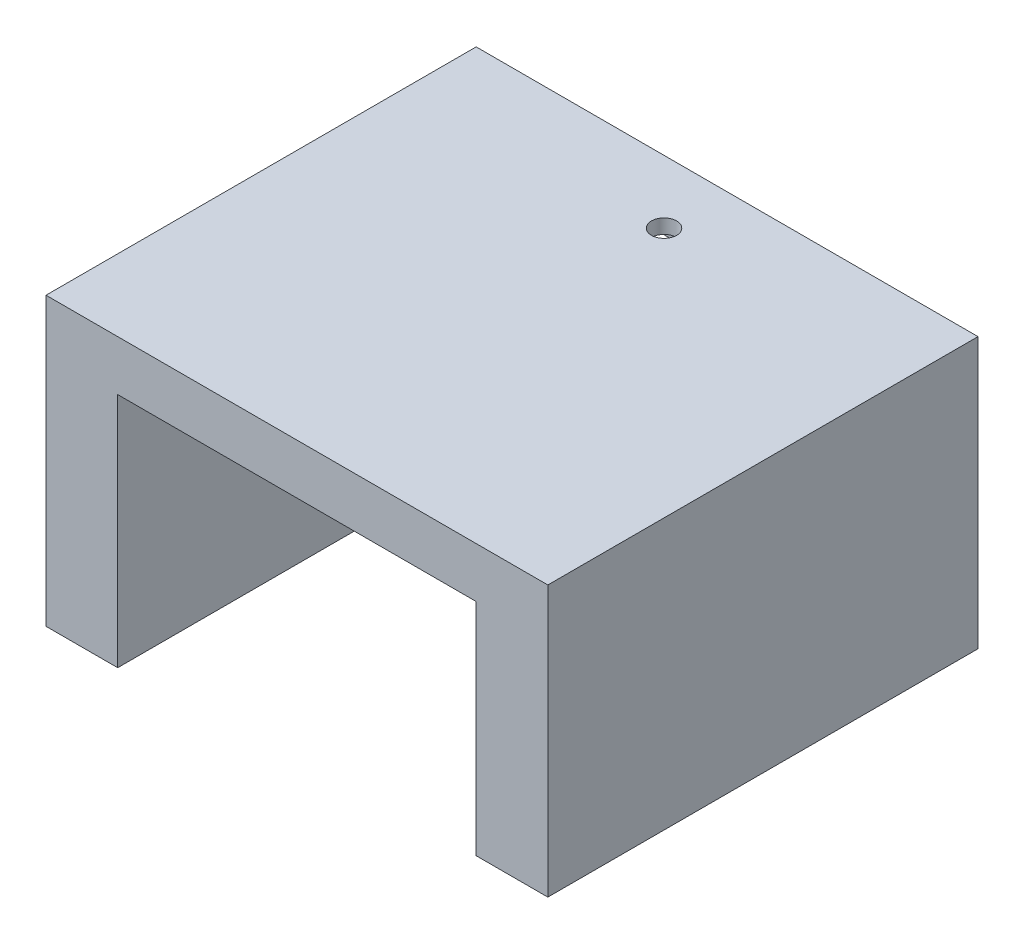
ISO-10303-21;
HEADER;
FILE_DESCRIPTION(('STEP AP214'),'2;1');
FILE_NAME('part.step','',(''),(''),'','','');
FILE_SCHEMA(('AUTOMOTIVE_DESIGN { 1 0 10303 214 1 1 1 1 }'));
ENDSEC;
DATA;
#1=APPLICATION_CONTEXT('core data for automotive mechanical design processes');
#2=APPLICATION_PROTOCOL_DEFINITION('international standard','automotive_design',2000,#1);
#3=PRODUCT_CONTEXT('',#1,'mechanical');
#4=PRODUCT('Part','Part','',(#3));
#5=PRODUCT_RELATED_PRODUCT_CATEGORY('part','',(#4));
#6=PRODUCT_DEFINITION_FORMATION('','',#4);
#7=PRODUCT_DEFINITION_CONTEXT('part definition',#1,'design');
#8=PRODUCT_DEFINITION('design','',#6,#7);
#9=PRODUCT_DEFINITION_SHAPE('','',#8);
#10=(LENGTH_UNIT() NAMED_UNIT(*) SI_UNIT(.MILLI.,.METRE.));
#11=(NAMED_UNIT(*) PLANE_ANGLE_UNIT() SI_UNIT($,.RADIAN.));
#12=(NAMED_UNIT(*) SI_UNIT($,.STERADIAN.) SOLID_ANGLE_UNIT());
#13=UNCERTAINTY_MEASURE_WITH_UNIT(LENGTH_MEASURE(1.E-05),#10,'distance_accuracy_value','');
#14=(GEOMETRIC_REPRESENTATION_CONTEXT(3) GLOBAL_UNCERTAINTY_ASSIGNED_CONTEXT((#13)) GLOBAL_UNIT_ASSIGNED_CONTEXT((#10,
#11,#12)) REPRESENTATION_CONTEXT('',''));
#15=CARTESIAN_POINT('',(0.,0.,0.));
#16=DIRECTION('',(0.,0.,1.));
#17=DIRECTION('',(1.,0.,0.));
#18=AXIS2_PLACEMENT_3D('',#15,#16,#17);
#19=CARTESIAN_POINT('',(11.0904833919075,-8.32284234752592,60.));
#20=DIRECTION('',(0.,-1.,0.));
#21=DIRECTION('',(0.,0.,-1.));
#22=AXIS2_PLACEMENT_3D('',#19,#20,#21);
#23=PLANE('',#22);
#24=CARTESIAN_POINT('',(-23.9095166080925,-8.32284234752592,8.79280196039261));
#25=DIRECTION('',(0.,1.,0.));
#26=DIRECTION('',(0.,0.,1.));
#27=AXIS2_PLACEMENT_3D('',#24,#25,#26);
#28=CIRCLE('',#27,1.75);
#29=CARTESIAN_POINT('',(-23.9095166080925,-8.32284234752592,10.5428019603926));
#30=VERTEX_POINT('',#29);
#31=EDGE_CURVE('E148',#30,#30,#28,.T.);
#32=ORIENTED_EDGE('',*,*,#31,.F.);
#33=EDGE_LOOP('',(#32));
#34=FACE_BOUND('',#33,.T.);
#35=DIRECTION('',(-1.,0.,0.));
#36=VECTOR('',#35,1.);
#37=CARTESIAN_POINT('',(11.0904833919075,-8.32284234752592,0.));
#38=LINE('',#37,#36);
#39=CARTESIAN_POINT('',(11.0904833919075,-8.32284234752592,0.));
#40=VERTEX_POINT('',#39);
#41=CARTESIAN_POINT('',(-58.9095166080925,-8.32284234752592,0.));
#42=VERTEX_POINT('',#41);
#43=EDGE_CURVE('E144',#40,#42,#38,.T.);
#44=ORIENTED_EDGE('',*,*,#43,.T.);
#45=DIRECTION('',(0.,0.,-1.));
#46=VECTOR('',#45,1.);
#47=CARTESIAN_POINT('',(-58.9095166080925,-8.32284234752592,60.));
#48=LINE('',#47,#46);
#49=CARTESIAN_POINT('',(-58.9095166080925,-8.32284234752592,60.));
#50=VERTEX_POINT('',#49);
#51=EDGE_CURVE('E11',#50,#42,#48,.T.);
#52=ORIENTED_EDGE('',*,*,#51,.F.);
#53=DIRECTION('',(-1.,0.,0.));
#54=VECTOR('',#53,1.);
#55=CARTESIAN_POINT('',(11.0904833919075,-8.32284234752592,60.));
#56=LINE('',#55,#54);
#57=CARTESIAN_POINT('',(11.0904833919075,-8.32284234752592,60.));
#58=VERTEX_POINT('',#57);
#59=EDGE_CURVE('E160',#58,#50,#56,.T.);
#60=ORIENTED_EDGE('',*,*,#59,.F.);
#61=DIRECTION('',(0.,0.,-1.));
#62=VECTOR('',#61,1.);
#63=CARTESIAN_POINT('',(11.0904833919075,-8.32284234752592,60.));
#64=LINE('',#63,#62);
#65=EDGE_CURVE('E140',#58,#40,#64,.T.);
#66=ORIENTED_EDGE('',*,*,#65,.T.);
#67=EDGE_LOOP('',(#44,#52,#60,#66));
#68=FACE_BOUND('',#67,.T.);
#69=ADVANCED_FACE('F35',(#34,#68),#23,.F.);
#70=CARTESIAN_POINT('',(-58.9095166080925,-8.32284234752592,60.));
#71=DIRECTION('',(1.,0.,0.));
#72=DIRECTION('',(0.,0.,-1.));
#73=AXIS2_PLACEMENT_3D('',#70,#71,#72);
#74=PLANE('',#73);
#75=DIRECTION('',(0.,-1.,0.));
#76=VECTOR('',#75,1.);
#77=CARTESIAN_POINT('',(-58.9095166080925,-8.32284234752592,0.));
#78=LINE('',#77,#76);
#79=CARTESIAN_POINT('',(-58.9095166080925,-48.3228423475259,0.));
#80=VERTEX_POINT('',#79);
#81=EDGE_CURVE('E147',#42,#80,#78,.T.);
#82=ORIENTED_EDGE('',*,*,#81,.T.);
#83=DIRECTION('',(0.,0.,-1.));
#84=VECTOR('',#83,1.);
#85=CARTESIAN_POINT('',(-58.9095166080925,-48.3228423475259,60.));
#86=LINE('',#85,#84);
#87=CARTESIAN_POINT('',(-58.9095166080925,-48.3228423475259,60.));
#88=VERTEX_POINT('',#87);
#89=EDGE_CURVE('E43',#88,#80,#86,.T.);
#90=ORIENTED_EDGE('',*,*,#89,.F.);
#91=DIRECTION('',(0.,-1.,0.));
#92=VECTOR('',#91,1.);
#93=CARTESIAN_POINT('',(-58.9095166080925,-8.32284234752592,60.));
#94=LINE('',#93,#92);
#95=EDGE_CURVE('E100',#50,#88,#94,.T.);
#96=ORIENTED_EDGE('',*,*,#95,.F.);
#97=ORIENTED_EDGE('',*,*,#51,.T.);
#98=EDGE_LOOP('',(#82,#90,#96,#97));
#99=FACE_BOUND('',#98,.T.);
#100=ADVANCED_FACE('F266',(#99),#74,.F.);
#101=CARTESIAN_POINT('',(-48.9095166080925,-48.3228423475259,60.));
#102=DIRECTION('',(0.,1.,0.));
#103=DIRECTION('',(0.,0.,1.));
#104=AXIS2_PLACEMENT_3D('',#101,#102,#103);
#105=PLANE('',#104);
#106=DIRECTION('',(1.,0.,0.));
#107=VECTOR('',#106,1.);
#108=CARTESIAN_POINT('',(-48.9095166080925,-48.3228423475259,0.));
#109=LINE('',#108,#107);
#110=CARTESIAN_POINT('',(-48.9095166080925,-48.3228423475259,0.));
#111=VERTEX_POINT('',#110);
#112=EDGE_CURVE('E150',#80,#111,#109,.T.);
#113=ORIENTED_EDGE('',*,*,#112,.T.);
#114=DIRECTION('',(0.,0.,-1.));
#115=VECTOR('',#114,1.);
#116=CARTESIAN_POINT('',(-48.9095166080925,-48.3228423475259,60.));
#117=LINE('',#116,#115);
#118=CARTESIAN_POINT('',(-48.9095166080925,-48.3228423475259,60.));
#119=VERTEX_POINT('',#118);
#120=EDGE_CURVE('E167',#119,#111,#117,.T.);
#121=ORIENTED_EDGE('',*,*,#120,.F.);
#122=DIRECTION('',(1.,0.,0.));
#123=VECTOR('',#122,1.);
#124=CARTESIAN_POINT('',(-48.9095166080925,-48.3228423475259,60.));
#125=LINE('',#124,#123);
#126=EDGE_CURVE('E176',#88,#119,#125,.T.);
#127=ORIENTED_EDGE('',*,*,#126,.F.);
#128=ORIENTED_EDGE('',*,*,#89,.T.);
#129=EDGE_LOOP('',(#113,#121,#127,#128));
#130=FACE_BOUND('',#129,.T.);
#131=ADVANCED_FACE('F174',(#130),#105,.F.);
#132=CARTESIAN_POINT('',(-48.9095166080926,-15.3228423475259,60.));
#133=DIRECTION('',(-1.,0.,0.));
#134=DIRECTION('',(0.,-1.,0.));
#135=AXIS2_PLACEMENT_3D('',#132,#133,#134);
#136=PLANE('',#135);
#137=DIRECTION('',(0.,1.,0.));
#138=VECTOR('',#137,1.);
#139=CARTESIAN_POINT('',(-48.9095166080926,-15.3228423475259,0.));
#140=LINE('',#139,#138);
#141=CARTESIAN_POINT('',(-48.9095166080926,-15.3228423475259,0.));
#142=VERTEX_POINT('',#141);
#143=EDGE_CURVE('E152',#111,#142,#140,.T.);
#144=ORIENTED_EDGE('',*,*,#143,.T.);
#145=DIRECTION('',(0.,0.,-1.));
#146=VECTOR('',#145,1.);
#147=CARTESIAN_POINT('',(-48.9095166080926,-15.3228423475259,60.));
#148=LINE('',#147,#146);
#149=CARTESIAN_POINT('',(-48.9095166080926,-15.3228423475259,60.));
#150=VERTEX_POINT('',#149);
#151=EDGE_CURVE('E164',#150,#142,#148,.T.);
#152=ORIENTED_EDGE('',*,*,#151,.F.);
#153=DIRECTION('',(0.,1.,0.));
#154=VECTOR('',#153,1.);
#155=CARTESIAN_POINT('',(-48.9095166080926,-15.3228423475259,60.));
#156=LINE('',#155,#154);
#157=EDGE_CURVE('E188',#119,#150,#156,.T.);
#158=ORIENTED_EDGE('',*,*,#157,.F.);
#159=ORIENTED_EDGE('',*,*,#120,.T.);
#160=EDGE_LOOP('',(#144,#152,#158,#159));
#161=FACE_BOUND('',#160,.T.);
#162=ADVANCED_FACE('F184',(#161),#136,.F.);
#163=CARTESIAN_POINT('',(-48.9095166080926,-15.3228423475259,60.));
#164=DIRECTION('',(0.,1.,0.));
#165=DIRECTION('',(0.,0.,1.));
#166=AXIS2_PLACEMENT_3D('',#163,#164,#165);
#167=PLANE('',#166);
#168=DIRECTION('',(1.,0.,0.));
#169=VECTOR('',#168,1.);
#170=CARTESIAN_POINT('',(-31.2991512706714,-15.3228423475259,2.59561227148507));
#171=LINE('',#170,#169);
#172=CARTESIAN_POINT('',(-31.2991512706714,-15.3228423475259,2.59561227148507));
#173=VERTEX_POINT('',#172);
#174=CARTESIAN_POINT('',(-16.5198819455137,-15.3228423475259,2.59561227148507));
#175=VERTEX_POINT('',#174);
#176=EDGE_CURVE('E214',#173,#175,#171,.T.);
#177=ORIENTED_EDGE('',*,*,#176,.F.);
#178=DIRECTION('',(0.,0.,-1.));
#179=VECTOR('',#178,1.);
#180=CARTESIAN_POINT('',(-31.2991512706714,-15.3228423475259,2.59561227148507));
#181=LINE('',#180,#179);
#182=CARTESIAN_POINT('',(-31.2991512706714,-15.3228423475259,14.9899916493001));
#183=VERTEX_POINT('',#182);
#184=EDGE_CURVE('E50',#183,#173,#181,.T.);
#185=ORIENTED_EDGE('',*,*,#184,.F.);
#186=DIRECTION('',(-1.,0.,0.));
#187=VECTOR('',#186,1.);
#188=CARTESIAN_POINT('',(-31.2991512706714,-15.3228423475259,14.9899916493001));
#189=LINE('',#188,#187);
#190=CARTESIAN_POINT('',(-16.5198819455137,-15.3228423475259,14.9899916493001));
#191=VERTEX_POINT('',#190);
#192=EDGE_CURVE('E207',#191,#183,#189,.T.);
#193=ORIENTED_EDGE('',*,*,#192,.F.);
#194=DIRECTION('',(0.,0.,1.));
#195=VECTOR('',#194,1.);
#196=CARTESIAN_POINT('',(-16.5198819455137,-15.3228423475259,2.59561227148507));
#197=LINE('',#196,#195);
#198=EDGE_CURVE('E211',#175,#191,#197,.T.);
#199=ORIENTED_EDGE('',*,*,#198,.F.);
#200=EDGE_LOOP('',(#177,#185,#193,#199));
#201=FACE_BOUND('',#200,.T.);
#202=DIRECTION('',(1.,0.,0.));
#203=VECTOR('',#202,1.);
#204=CARTESIAN_POINT('',(-48.9095166080926,-15.3228423475259,0.));
#205=LINE('',#204,#203);
#206=CARTESIAN_POINT('',(1.09048339190746,-15.3228423475259,0.));
#207=VERTEX_POINT('',#206);
#208=EDGE_CURVE('E154',#142,#207,#205,.T.);
#209=ORIENTED_EDGE('',*,*,#208,.T.);
#210=DIRECTION('',(0.,0.,-1.));
#211=VECTOR('',#210,1.);
#212=CARTESIAN_POINT('',(1.09048339190746,-15.3228423475259,60.));
#213=LINE('',#212,#211);
#214=CARTESIAN_POINT('',(1.09048339190746,-15.3228423475259,60.));
#215=VERTEX_POINT('',#214);
#216=EDGE_CURVE('E135',#215,#207,#213,.T.);
#217=ORIENTED_EDGE('',*,*,#216,.F.);
#218=DIRECTION('',(1.,0.,0.));
#219=VECTOR('',#218,1.);
#220=CARTESIAN_POINT('',(-48.9095166080926,-15.3228423475259,60.));
#221=LINE('',#220,#219);
#222=EDGE_CURVE('E123',#150,#215,#221,.T.);
#223=ORIENTED_EDGE('',*,*,#222,.F.);
#224=ORIENTED_EDGE('',*,*,#151,.T.);
#225=EDGE_LOOP('',(#209,#217,#223,#224));
#226=FACE_BOUND('',#225,.T.);
#227=ADVANCED_FACE('F187',(#201,#226),#167,.F.);
#228=CARTESIAN_POINT('',(1.09048339190746,-15.3228423475259,60.));
#229=DIRECTION('',(1.,0.,0.));
#230=DIRECTION('',(0.,0.,-1.));
#231=AXIS2_PLACEMENT_3D('',#228,#229,#230);
#232=PLANE('',#231);
#233=DIRECTION('',(0.,-1.,0.));
#234=VECTOR('',#233,1.);
#235=CARTESIAN_POINT('',(1.09048339190746,-15.3228423475259,0.));
#236=LINE('',#235,#234);
#237=CARTESIAN_POINT('',(1.09048339190746,-46.0338228922035,0.));
#238=VERTEX_POINT('',#237);
#239=EDGE_CURVE('E132',#207,#238,#236,.T.);
#240=ORIENTED_EDGE('',*,*,#239,.T.);
#241=DIRECTION('',(0.,0.,-1.));
#242=VECTOR('',#241,1.);
#243=CARTESIAN_POINT('',(1.09048339190746,-46.0338228922035,60.));
#244=LINE('',#243,#242);
#245=CARTESIAN_POINT('',(1.09048339190746,-46.0338228922035,60.));
#246=VERTEX_POINT('',#245);
#247=EDGE_CURVE('E129',#246,#238,#244,.T.);
#248=ORIENTED_EDGE('',*,*,#247,.F.);
#249=DIRECTION('',(0.,-1.,0.));
#250=VECTOR('',#249,1.);
#251=CARTESIAN_POINT('',(1.09048339190746,-15.3228423475259,60.));
#252=LINE('',#251,#250);
#253=EDGE_CURVE('E116',#215,#246,#252,.T.);
#254=ORIENTED_EDGE('',*,*,#253,.F.);
#255=ORIENTED_EDGE('',*,*,#216,.T.);
#256=EDGE_LOOP('',(#240,#248,#254,#255));
#257=FACE_BOUND('',#256,.T.);
#258=ADVANCED_FACE('F130',(#257),#232,.F.);
#259=CARTESIAN_POINT('',(1.09048339190746,-46.0338228922035,60.));
#260=DIRECTION('',(0.,1.,0.));
#261=DIRECTION('',(-1.,0.,0.));
#262=AXIS2_PLACEMENT_3D('',#259,#260,#261);
#263=PLANE('',#262);
#264=DIRECTION('',(1.,0.,0.));
#265=VECTOR('',#264,1.);
#266=CARTESIAN_POINT('',(1.09048339190746,-46.0338228922035,0.));
#267=LINE('',#266,#265);
#268=CARTESIAN_POINT('',(11.0904833919075,-46.0338228922035,0.));
#269=VERTEX_POINT('',#268);
#270=EDGE_CURVE('E157',#238,#269,#267,.T.);
#271=ORIENTED_EDGE('',*,*,#270,.T.);
#272=DIRECTION('',(0.,0.,-1.));
#273=VECTOR('',#272,1.);
#274=CARTESIAN_POINT('',(11.0904833919075,-46.0338228922035,60.));
#275=LINE('',#274,#273);
#276=CARTESIAN_POINT('',(11.0904833919075,-46.0338228922035,60.));
#277=VERTEX_POINT('',#276);
#278=EDGE_CURVE('E136',#277,#269,#275,.T.);
#279=ORIENTED_EDGE('',*,*,#278,.F.);
#280=DIRECTION('',(1.,0.,0.));
#281=VECTOR('',#280,1.);
#282=CARTESIAN_POINT('',(1.09048339190746,-46.0338228922035,60.));
#283=LINE('',#282,#281);
#284=EDGE_CURVE('E120',#246,#277,#283,.T.);
#285=ORIENTED_EDGE('',*,*,#284,.F.);
#286=ORIENTED_EDGE('',*,*,#247,.T.);
#287=EDGE_LOOP('',(#271,#279,#285,#286));
#288=FACE_BOUND('',#287,.T.);
#289=ADVANCED_FACE('F138',(#288),#263,.F.);
#290=CARTESIAN_POINT('',(11.0904833919075,-8.32284234752592,60.));
#291=DIRECTION('',(-1.,0.,0.));
#292=DIRECTION('',(0.,-1.,0.));
#293=AXIS2_PLACEMENT_3D('',#290,#291,#292);
#294=PLANE('',#293);
#295=DIRECTION('',(0.,1.,0.));
#296=VECTOR('',#295,1.);
#297=CARTESIAN_POINT('',(11.0904833919075,-8.32284234752592,0.));
#298=LINE('',#297,#296);
#299=EDGE_CURVE('E92',#269,#40,#298,.T.);
#300=ORIENTED_EDGE('',*,*,#299,.T.);
#301=ORIENTED_EDGE('',*,*,#65,.F.);
#302=DIRECTION('',(0.,1.,0.));
#303=VECTOR('',#302,1.);
#304=CARTESIAN_POINT('',(11.0904833919075,-8.32284234752592,60.));
#305=LINE('',#304,#303);
#306=EDGE_CURVE('E59',#277,#58,#305,.T.);
#307=ORIENTED_EDGE('',*,*,#306,.F.);
#308=ORIENTED_EDGE('',*,*,#278,.T.);
#309=EDGE_LOOP('',(#300,#301,#307,#308));
#310=FACE_BOUND('',#309,.T.);
#311=ADVANCED_FACE('F275',(#310),#294,.F.);
#312=CARTESIAN_POINT('',(0.,0.,60.));
#313=DIRECTION('',(0.,0.,1.));
#314=DIRECTION('',(1.,0.,0.));
#315=AXIS2_PLACEMENT_3D('',#312,#313,#314);
#316=PLANE('',#315);
#317=ORIENTED_EDGE('',*,*,#59,.T.);
#318=ORIENTED_EDGE('',*,*,#95,.T.);
#319=ORIENTED_EDGE('',*,*,#126,.T.);
#320=ORIENTED_EDGE('',*,*,#157,.T.);
#321=ORIENTED_EDGE('',*,*,#222,.T.);
#322=ORIENTED_EDGE('',*,*,#253,.T.);
#323=ORIENTED_EDGE('',*,*,#284,.T.);
#324=ORIENTED_EDGE('',*,*,#306,.T.);
#325=EDGE_LOOP('',(#317,#318,#319,#320,#321,#322,#323,#324));
#326=FACE_BOUND('',#325,.T.);
#327=ADVANCED_FACE('F118',(#326),#316,.T.);
#328=CARTESIAN_POINT('',(0.,0.,0.));
#329=DIRECTION('',(0.,0.,1.));
#330=DIRECTION('',(1.,0.,0.));
#331=AXIS2_PLACEMENT_3D('',#328,#329,#330);
#332=PLANE('',#331);
#333=ORIENTED_EDGE('',*,*,#43,.F.);
#334=ORIENTED_EDGE('',*,*,#299,.F.);
#335=ORIENTED_EDGE('',*,*,#270,.F.);
#336=ORIENTED_EDGE('',*,*,#239,.F.);
#337=ORIENTED_EDGE('',*,*,#208,.F.);
#338=ORIENTED_EDGE('',*,*,#143,.F.);
#339=ORIENTED_EDGE('',*,*,#112,.F.);
#340=ORIENTED_EDGE('',*,*,#81,.F.);
#341=EDGE_LOOP('',(#333,#334,#335,#336,#337,#338,#339,#340));
#342=FACE_BOUND('',#341,.T.);
#343=ADVANCED_FACE('F180',(#342),#332,.F.);
#344=CARTESIAN_POINT('',(-23.9095166080925,-48.3228423475259,8.79280196039261));
#345=DIRECTION('',(0.,1.,0.));
#346=DIRECTION('',(0.,0.,1.));
#347=AXIS2_PLACEMENT_3D('',#344,#345,#346);
#348=CYLINDRICAL_SURFACE('',#347,1.75);
#349=CARTESIAN_POINT('',(-23.9095166080925,-10.3228423475259,8.79280196039261));
#350=DIRECTION('',(0.,1.,0.));
#351=DIRECTION('',(0.,0.,1.));
#352=AXIS2_PLACEMENT_3D('',#349,#350,#351);
#353=CIRCLE('',#352,1.75);
#354=CARTESIAN_POINT('',(-23.9095166080925,-10.3228423475259,10.5428019603926));
#355=VERTEX_POINT('',#354);
#356=EDGE_CURVE('E38',#355,#355,#353,.F.);
#357=ORIENTED_EDGE('',*,*,#356,.T.);
#358=EDGE_LOOP('',(#357));
#359=FACE_BOUND('',#358,.T.);
#360=ORIENTED_EDGE('',*,*,#31,.T.);
#361=EDGE_LOOP('',(#360));
#362=FACE_BOUND('',#361,.T.);
#363=ADVANCED_FACE('F332',(#359,#362),#348,.F.);
#364=CARTESIAN_POINT('',(0.,-10.3228423475259,0.));
#365=DIRECTION('',(0.,1.,0.));
#366=DIRECTION('',(0.,0.,1.));
#367=AXIS2_PLACEMENT_3D('',#364,#365,#366);
#368=PLANE('',#367);
#369=DIRECTION('',(0.,0.,-1.));
#370=VECTOR('',#369,1.);
#371=CARTESIAN_POINT('',(-31.2991512706714,-10.3228423475259,2.59561227148507));
#372=LINE('',#371,#370);
#373=CARTESIAN_POINT('',(-31.2991512706714,-10.3228423475259,14.9899916493001));
#374=VERTEX_POINT('',#373);
#375=CARTESIAN_POINT('',(-31.2991512706714,-10.3228423475259,2.59561227148507));
#376=VERTEX_POINT('',#375);
#377=EDGE_CURVE('E210',#374,#376,#372,.T.);
#378=ORIENTED_EDGE('',*,*,#377,.T.);
#379=DIRECTION('',(1.,0.,0.));
#380=VECTOR('',#379,1.);
#381=CARTESIAN_POINT('',(-31.2991512706714,-10.3228423475259,2.59561227148507));
#382=LINE('',#381,#380);
#383=CARTESIAN_POINT('',(-16.5198819455137,-10.3228423475259,2.59561227148507));
#384=VERTEX_POINT('',#383);
#385=EDGE_CURVE('E223',#376,#384,#382,.T.);
#386=ORIENTED_EDGE('',*,*,#385,.T.);
#387=DIRECTION('',(0.,0.,1.));
#388=VECTOR('',#387,1.);
#389=CARTESIAN_POINT('',(-16.5198819455137,-10.3228423475259,2.59561227148507));
#390=LINE('',#389,#388);
#391=CARTESIAN_POINT('',(-16.5198819455137,-10.3228423475259,14.9899916493001));
#392=VERTEX_POINT('',#391);
#393=EDGE_CURVE('E220',#384,#392,#390,.T.);
#394=ORIENTED_EDGE('',*,*,#393,.T.);
#395=DIRECTION('',(-1.,0.,0.));
#396=VECTOR('',#395,1.);
#397=CARTESIAN_POINT('',(-31.2991512706714,-10.3228423475259,14.9899916493001));
#398=LINE('',#397,#396);
#399=EDGE_CURVE('E199',#392,#374,#398,.T.);
#400=ORIENTED_EDGE('',*,*,#399,.T.);
#401=EDGE_LOOP('',(#378,#386,#394,#400));
#402=FACE_BOUND('',#401,.T.);
#403=ORIENTED_EDGE('',*,*,#356,.F.);
#404=EDGE_LOOP('',(#403));
#405=FACE_BOUND('',#404,.T.);
#406=ADVANCED_FACE('F230',(#402,#405),#368,.F.);
#407=CARTESIAN_POINT('',(-31.2991512706714,-10.3228423475259,2.59561227148507));
#408=DIRECTION('',(-1.,0.,0.));
#409=DIRECTION('',(0.,0.,1.));
#410=AXIS2_PLACEMENT_3D('',#407,#408,#409);
#411=PLANE('',#410);
#412=ORIENTED_EDGE('',*,*,#184,.T.);
#413=DIRECTION('',(0.,-1.,0.));
#414=VECTOR('',#413,1.);
#415=CARTESIAN_POINT('',(-31.2991512706714,-10.3228423475259,2.59561227148507));
#416=LINE('',#415,#414);
#417=EDGE_CURVE('E196',#376,#173,#416,.T.);
#418=ORIENTED_EDGE('',*,*,#417,.F.);
#419=ORIENTED_EDGE('',*,*,#377,.F.);
#420=DIRECTION('',(0.,-1.,0.));
#421=VECTOR('',#420,1.);
#422=CARTESIAN_POINT('',(-31.2991512706714,-10.3228423475259,14.9899916493001));
#423=LINE('',#422,#421);
#424=EDGE_CURVE('E205',#374,#183,#423,.T.);
#425=ORIENTED_EDGE('',*,*,#424,.T.);
#426=EDGE_LOOP('',(#412,#418,#419,#425));
#427=FACE_BOUND('',#426,.T.);
#428=ADVANCED_FACE('F236',(#427),#411,.F.);
#429=CARTESIAN_POINT('',(-31.2991512706714,-10.3228423475259,14.9899916493001));
#430=DIRECTION('',(0.,0.,1.));
#431=DIRECTION('',(1.,0.,0.));
#432=AXIS2_PLACEMENT_3D('',#429,#430,#431);
#433=PLANE('',#432);
#434=ORIENTED_EDGE('',*,*,#192,.T.);
#435=ORIENTED_EDGE('',*,*,#424,.F.);
#436=ORIENTED_EDGE('',*,*,#399,.F.);
#437=DIRECTION('',(0.,-1.,0.));
#438=VECTOR('',#437,1.);
#439=CARTESIAN_POINT('',(-16.5198819455137,-10.3228423475259,14.9899916493001));
#440=LINE('',#439,#438);
#441=EDGE_CURVE('E202',#392,#191,#440,.T.);
#442=ORIENTED_EDGE('',*,*,#441,.T.);
#443=EDGE_LOOP('',(#434,#435,#436,#442));
#444=FACE_BOUND('',#443,.T.);
#445=ADVANCED_FACE('F247',(#444),#433,.F.);
#446=CARTESIAN_POINT('',(-16.5198819455137,-10.3228423475259,2.59561227148507));
#447=DIRECTION('',(1.,0.,0.));
#448=DIRECTION('',(0.,0.,-1.));
#449=AXIS2_PLACEMENT_3D('',#446,#447,#448);
#450=PLANE('',#449);
#451=ORIENTED_EDGE('',*,*,#198,.T.);
#452=ORIENTED_EDGE('',*,*,#441,.F.);
#453=ORIENTED_EDGE('',*,*,#393,.F.);
#454=DIRECTION('',(0.,-1.,0.));
#455=VECTOR('',#454,1.);
#456=CARTESIAN_POINT('',(-16.5198819455137,-10.3228423475259,2.59561227148507));
#457=LINE('',#456,#455);
#458=EDGE_CURVE('E198',#384,#175,#457,.T.);
#459=ORIENTED_EDGE('',*,*,#458,.T.);
#460=EDGE_LOOP('',(#451,#452,#453,#459));
#461=FACE_BOUND('',#460,.T.);
#462=ADVANCED_FACE('F252',(#461),#450,.F.);
#463=CARTESIAN_POINT('',(-31.2991512706714,-10.3228423475259,2.59561227148507));
#464=DIRECTION('',(0.,0.,-1.));
#465=DIRECTION('',(-1.,0.,0.));
#466=AXIS2_PLACEMENT_3D('',#463,#464,#465);
#467=PLANE('',#466);
#468=ORIENTED_EDGE('',*,*,#176,.T.);
#469=ORIENTED_EDGE('',*,*,#458,.F.);
#470=ORIENTED_EDGE('',*,*,#385,.F.);
#471=ORIENTED_EDGE('',*,*,#417,.T.);
#472=EDGE_LOOP('',(#468,#469,#470,#471));
#473=FACE_BOUND('',#472,.T.);
#474=ADVANCED_FACE('F257',(#473),#467,.F.);
#475=CLOSED_SHELL('',(#69,#100,#131,#162,#227,#258,#289,#311,#327,#343,#363,#406,#428,#445,#462,#474));
#476=MANIFOLD_SOLID_BREP('B2',#475);
#477=ADVANCED_BREP_SHAPE_REPRESENTATION('',(#18,#476),#14);
#478=SHAPE_DEFINITION_REPRESENTATION(#9,#477);
ENDSEC;
END-ISO-10303-21;
